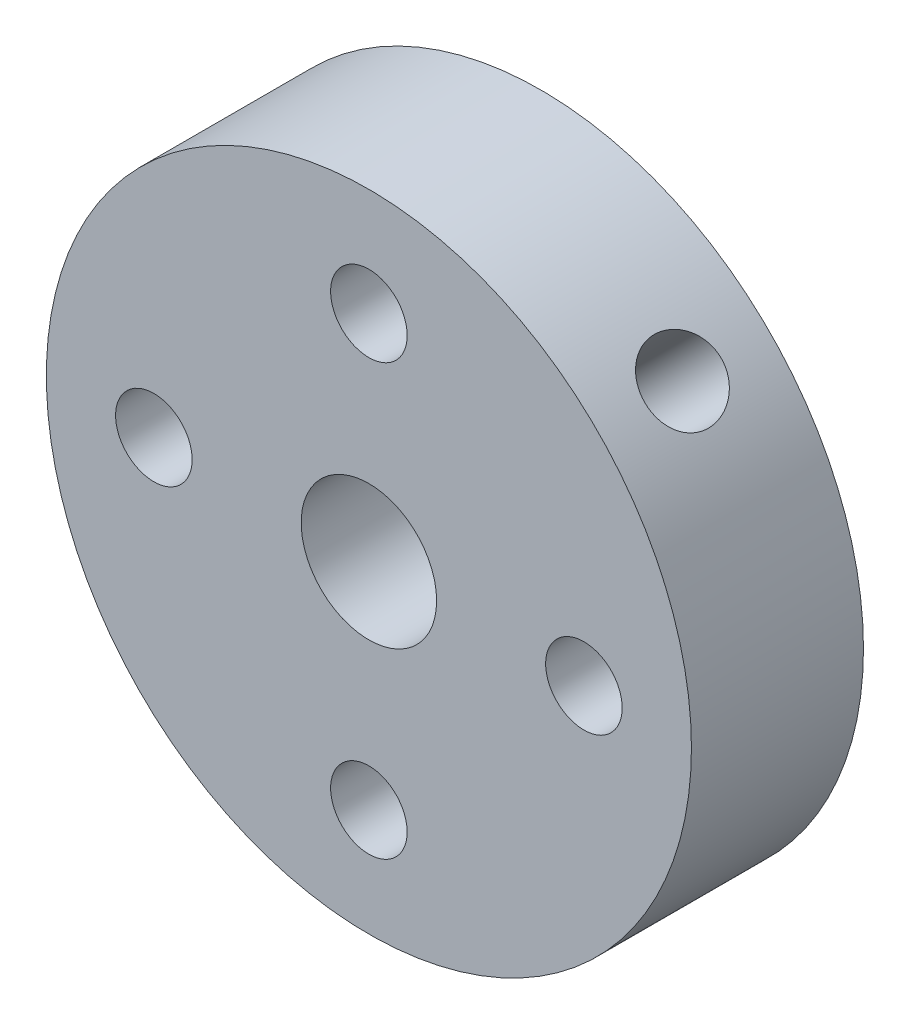
ISO-10303-21;
HEADER;
FILE_DESCRIPTION(('STEP AP214'),'2;1');
FILE_NAME('part.step','',(''),(''),'','','');
FILE_SCHEMA(('AUTOMOTIVE_DESIGN { 1 0 10303 214 1 1 1 1 }'));
ENDSEC;
DATA;
#1=APPLICATION_CONTEXT('core data for automotive mechanical design processes');
#2=APPLICATION_PROTOCOL_DEFINITION('international standard','automotive_design',2000,#1);
#3=PRODUCT_CONTEXT('',#1,'mechanical');
#4=PRODUCT('Part','Part','',(#3));
#5=PRODUCT_RELATED_PRODUCT_CATEGORY('part','',(#4));
#6=PRODUCT_DEFINITION_FORMATION('','',#4);
#7=PRODUCT_DEFINITION_CONTEXT('part definition',#1,'design');
#8=PRODUCT_DEFINITION('design','',#6,#7);
#9=PRODUCT_DEFINITION_SHAPE('','',#8);
#10=(LENGTH_UNIT() NAMED_UNIT(*) SI_UNIT(.MILLI.,.METRE.));
#11=(NAMED_UNIT(*) PLANE_ANGLE_UNIT() SI_UNIT($,.RADIAN.));
#12=(NAMED_UNIT(*) SI_UNIT($,.STERADIAN.) SOLID_ANGLE_UNIT());
#13=UNCERTAINTY_MEASURE_WITH_UNIT(LENGTH_MEASURE(1.E-05),#10,'distance_accuracy_value','');
#14=(GEOMETRIC_REPRESENTATION_CONTEXT(3) GLOBAL_UNCERTAINTY_ASSIGNED_CONTEXT((#13)) GLOBAL_UNIT_ASSIGNED_CONTEXT((#10,
#11,#12)) REPRESENTATION_CONTEXT('',''));
#15=CARTESIAN_POINT('',(0.,0.,0.));
#16=DIRECTION('',(0.,0.,1.));
#17=DIRECTION('',(1.,0.,0.));
#18=AXIS2_PLACEMENT_3D('',#15,#16,#17);
#19=CARTESIAN_POINT('',(0.,0.,5.08));
#20=DIRECTION('',(0.,0.,1.));
#21=DIRECTION('',(1.,0.,0.));
#22=AXIS2_PLACEMENT_3D('',#19,#20,#21);
#23=PLANE('',#22);
#24=CARTESIAN_POINT('',(6.35,0.,5.08));
#25=DIRECTION('',(0.,0.,1.));
#26=DIRECTION('',(1.,0.,0.));
#27=AXIS2_PLACEMENT_3D('',#24,#25,#26);
#28=CIRCLE('',#27,1.1303);
#29=CARTESIAN_POINT('',(7.4803,0.,5.08));
#30=VERTEX_POINT('',#29);
#31=EDGE_CURVE('E68',#30,#30,#28,.T.);
#32=ORIENTED_EDGE('',*,*,#31,.F.);
#33=EDGE_LOOP('',(#32));
#34=FACE_BOUND('',#33,.T.);
#35=CARTESIAN_POINT('',(-6.35,0.,5.08));
#36=DIRECTION('',(0.,0.,1.));
#37=DIRECTION('',(1.,0.,0.));
#38=AXIS2_PLACEMENT_3D('',#35,#36,#37);
#39=CIRCLE('',#38,1.1303);
#40=CARTESIAN_POINT('',(-5.2197,0.,5.08));
#41=VERTEX_POINT('',#40);
#42=EDGE_CURVE('E56',#41,#41,#39,.T.);
#43=ORIENTED_EDGE('',*,*,#42,.F.);
#44=EDGE_LOOP('',(#43));
#45=FACE_BOUND('',#44,.T.);
#46=CARTESIAN_POINT('',(0.,0.,5.08));
#47=DIRECTION('',(0.,0.,1.));
#48=DIRECTION('',(1.,0.,0.));
#49=AXIS2_PLACEMENT_3D('',#46,#47,#48);
#50=CIRCLE('',#49,9.525);
#51=CARTESIAN_POINT('',(9.525,0.,5.08));
#52=VERTEX_POINT('',#51);
#53=EDGE_CURVE('E10',#52,#52,#50,.T.);
#54=ORIENTED_EDGE('',*,*,#53,.T.);
#55=EDGE_LOOP('',(#54));
#56=FACE_BOUND('',#55,.T.);
#57=CARTESIAN_POINT('',(0.,0.,5.08));
#58=DIRECTION('',(0.,0.,1.));
#59=DIRECTION('',(1.,0.,0.));
#60=AXIS2_PLACEMENT_3D('',#57,#58,#59);
#61=CIRCLE('',#60,2.);
#62=CARTESIAN_POINT('',(2.,0.,5.08));
#63=VERTEX_POINT('',#62);
#64=EDGE_CURVE('E51',#63,#63,#61,.T.);
#65=ORIENTED_EDGE('',*,*,#64,.F.);
#66=EDGE_LOOP('',(#65));
#67=FACE_BOUND('',#66,.T.);
#68=CARTESIAN_POINT('',(0.,6.35,5.08));
#69=DIRECTION('',(0.,0.,1.));
#70=DIRECTION('',(1.,0.,0.));
#71=AXIS2_PLACEMENT_3D('',#68,#69,#70);
#72=CIRCLE('',#71,1.1303);
#73=CARTESIAN_POINT('',(1.13030000000002,6.35,5.08));
#74=VERTEX_POINT('',#73);
#75=EDGE_CURVE('E62',#74,#74,#72,.T.);
#76=ORIENTED_EDGE('',*,*,#75,.F.);
#77=EDGE_LOOP('',(#76));
#78=FACE_BOUND('',#77,.T.);
#79=CARTESIAN_POINT('',(0.,-6.35,5.08));
#80=DIRECTION('',(0.,0.,1.));
#81=DIRECTION('',(1.,0.,0.));
#82=AXIS2_PLACEMENT_3D('',#79,#80,#81);
#83=CIRCLE('',#82,1.1303);
#84=CARTESIAN_POINT('',(1.13029999999993,-6.35,5.08));
#85=VERTEX_POINT('',#84);
#86=EDGE_CURVE('E74',#85,#85,#83,.T.);
#87=ORIENTED_EDGE('',*,*,#86,.F.);
#88=EDGE_LOOP('',(#87));
#89=FACE_BOUND('',#88,.T.);
#90=ADVANCED_FACE('F33',(#34,#45,#56,#67,#78,#89),#23,.T.);
#91=CARTESIAN_POINT('',(0.,0.,0.));
#92=DIRECTION('',(0.,0.,1.));
#93=DIRECTION('',(1.,0.,0.));
#94=AXIS2_PLACEMENT_3D('',#91,#92,#93);
#95=PLANE('',#94);
#96=CARTESIAN_POINT('',(6.35,0.,0.));
#97=DIRECTION('',(0.,0.,1.));
#98=DIRECTION('',(1.,0.,0.));
#99=AXIS2_PLACEMENT_3D('',#96,#97,#98);
#100=CIRCLE('',#99,1.1303);
#101=CARTESIAN_POINT('',(7.4803,0.,0.));
#102=VERTEX_POINT('',#101);
#103=EDGE_CURVE('E71',#102,#102,#100,.T.);
#104=ORIENTED_EDGE('',*,*,#103,.T.);
#105=EDGE_LOOP('',(#104));
#106=FACE_BOUND('',#105,.T.);
#107=CARTESIAN_POINT('',(-6.35,0.,0.));
#108=DIRECTION('',(0.,0.,1.));
#109=DIRECTION('',(1.,0.,0.));
#110=AXIS2_PLACEMENT_3D('',#107,#108,#109);
#111=CIRCLE('',#110,1.1303);
#112=CARTESIAN_POINT('',(-5.2197,0.,0.));
#113=VERTEX_POINT('',#112);
#114=EDGE_CURVE('E59',#113,#113,#111,.T.);
#115=ORIENTED_EDGE('',*,*,#114,.T.);
#116=EDGE_LOOP('',(#115));
#117=FACE_BOUND('',#116,.T.);
#118=CARTESIAN_POINT('',(0.,0.,0.));
#119=DIRECTION('',(0.,0.,1.));
#120=DIRECTION('',(1.,0.,0.));
#121=AXIS2_PLACEMENT_3D('',#118,#119,#120);
#122=CIRCLE('',#121,9.525);
#123=CARTESIAN_POINT('',(9.525,0.,0.));
#124=VERTEX_POINT('',#123);
#125=EDGE_CURVE('E46',#124,#124,#122,.T.);
#126=ORIENTED_EDGE('',*,*,#125,.F.);
#127=EDGE_LOOP('',(#126));
#128=FACE_BOUND('',#127,.T.);
#129=CARTESIAN_POINT('',(0.,0.,0.));
#130=DIRECTION('',(0.,0.,1.));
#131=DIRECTION('',(1.,0.,0.));
#132=AXIS2_PLACEMENT_3D('',#129,#130,#131);
#133=CIRCLE('',#132,2.);
#134=CARTESIAN_POINT('',(2.,0.,0.));
#135=VERTEX_POINT('',#134);
#136=EDGE_CURVE('E53',#135,#135,#133,.T.);
#137=ORIENTED_EDGE('',*,*,#136,.T.);
#138=EDGE_LOOP('',(#137));
#139=FACE_BOUND('',#138,.T.);
#140=CARTESIAN_POINT('',(0.,6.35,0.));
#141=DIRECTION('',(0.,0.,1.));
#142=DIRECTION('',(1.,0.,0.));
#143=AXIS2_PLACEMENT_3D('',#140,#141,#142);
#144=CIRCLE('',#143,1.1303);
#145=CARTESIAN_POINT('',(1.13030000000002,6.35,0.));
#146=VERTEX_POINT('',#145);
#147=EDGE_CURVE('E65',#146,#146,#144,.T.);
#148=ORIENTED_EDGE('',*,*,#147,.T.);
#149=EDGE_LOOP('',(#148));
#150=FACE_BOUND('',#149,.T.);
#151=CARTESIAN_POINT('',(0.,-6.35,0.));
#152=DIRECTION('',(0.,0.,1.));
#153=DIRECTION('',(1.,0.,0.));
#154=AXIS2_PLACEMENT_3D('',#151,#152,#153);
#155=CIRCLE('',#154,1.1303);
#156=CARTESIAN_POINT('',(1.13029999999993,-6.35,0.));
#157=VERTEX_POINT('',#156);
#158=EDGE_CURVE('E77',#157,#157,#155,.T.);
#159=ORIENTED_EDGE('',*,*,#158,.T.);
#160=EDGE_LOOP('',(#159));
#161=FACE_BOUND('',#160,.T.);
#162=ADVANCED_FACE('F113',(#106,#117,#128,#139,#150,#161),#95,.F.);
#163=CARTESIAN_POINT('',(0.,0.,5.08));
#164=DIRECTION('',(0.,0.,-1.));
#165=DIRECTION('',(-1.,0.,0.));
#166=AXIS2_PLACEMENT_3D('',#163,#164,#165);
#167=CYLINDRICAL_SURFACE('',#166,9.525);
#168=CARTESIAN_POINT('',(5.88835942537819,7.48684501492851,2.54));
#169=CARTESIAN_POINT('',(5.88836195095317,7.48684371644301,2.47675083023152));
#170=CARTESIAN_POINT('',(5.89257955251751,7.48353185659465,2.41346150046686));
#171=CARTESIAN_POINT('',(5.90930099826138,7.47033438245385,2.28864237142658));
#172=CARTESIAN_POINT('',(5.92181363090027,7.46044179594316,2.22711451060301));
#173=CARTESIAN_POINT('',(5.95464092558272,7.43426622977027,2.10764367538076));
#174=CARTESIAN_POINT('',(5.97495044743216,7.4179874601227,2.04969836829954));
#175=CARTESIAN_POINT('',(6.02261482930935,7.37934092821963,1.93898333748816));
#176=CARTESIAN_POINT('',(6.04996843169233,7.35697425285361,1.88621269219769));
#177=CARTESIAN_POINT('',(6.11088325226502,7.30645598401452,1.78706674838293));
#178=CARTESIAN_POINT('',(6.14447193256567,7.27827873476532,1.74072139175397));
#179=CARTESIAN_POINT('',(6.21661016004974,7.2167600545004,1.65600003105462));
#180=CARTESIAN_POINT('',(6.25515994832758,7.18341837249326,1.61762441452585));
#181=CARTESIAN_POINT('',(6.33604808507048,7.11217466377855,1.54982538353728));
#182=CARTESIAN_POINT('',(6.3783973580081,7.07425937164084,1.52042892784532));
#183=CARTESIAN_POINT('',(6.46540207301569,6.99483143682025,1.47159528680366));
#184=CARTESIAN_POINT('',(6.5100574375236,6.95331891509317,1.45215776673944));
#185=CARTESIAN_POINT('',(6.60005194815221,6.86795208289868,1.42388283449897));
#186=CARTESIAN_POINT('',(6.64538686637488,6.82410976435156,1.41499577009914));
#187=CARTESIAN_POINT('',(6.73558439792912,6.73509773549741,1.40792020794054));
#188=CARTESIAN_POINT('',(6.7804470280509,6.68992807259647,1.40973132855718));
#189=CARTESIAN_POINT('',(6.86820386152361,6.599798372251,1.42396079393402));
#190=CARTESIAN_POINT('',(6.91110683052498,6.55483842314752,1.4363257418347));
#191=CARTESIAN_POINT('',(6.9940586173456,6.46625499744921,1.47122847396179));
#192=CARTESIAN_POINT('',(7.0341073854703,6.42263154413169,1.49376643526071));
#193=CARTESIAN_POINT('',(7.11047389982341,6.33798444025193,1.54843268947244));
#194=CARTESIAN_POINT('',(7.14678231052368,6.29696738819746,1.5805842326774));
#195=CARTESIAN_POINT('',(7.21474731577014,6.21898110942085,1.65354808279929));
#196=CARTESIAN_POINT('',(7.24640371790586,6.18201205014275,1.69436074777599));
#197=CARTESIAN_POINT('',(7.30459052177825,6.1131523151431,1.78378773040749));
#198=CARTESIAN_POINT('',(7.33108814330646,6.08129432791138,1.83244856131957));
#199=CARTESIAN_POINT('',(7.37819326489261,6.02405740006055,1.93603038653666));
#200=CARTESIAN_POINT('',(7.39880074961866,5.99867847630631,1.99095139713625));
#201=CARTESIAN_POINT('',(7.43374431095623,5.95532114846176,2.1055342677617));
#202=CARTESIAN_POINT('',(7.44807813319183,5.93734540476463,2.16519782288701));
#203=CARTESIAN_POINT('',(7.47019783719619,5.90949139153398,2.28755178056522));
#204=CARTESIAN_POINT('',(7.47798400239078,5.89961277150397,2.35024205197765));
#205=CARTESIAN_POINT('',(7.48683917624636,5.88837124710133,2.47646170976712));
#206=CARTESIAN_POINT('',(7.48794874725196,5.88695691985536,2.53998367450721));
#207=CARTESIAN_POINT('',(7.48353900948199,5.89256150655298,2.66642145646119));
#208=CARTESIAN_POINT('',(7.47801982772236,5.89958025890725,2.72933728526618));
#209=CARTESIAN_POINT('',(7.4604797638959,5.92174496154769,2.85258339037514));
#210=CARTESIAN_POINT('',(7.44847854956712,5.93686632585195,2.91292089524452));
#211=CARTESIAN_POINT('',(7.41820432802201,5.9746507992698,3.02952333352779));
#212=CARTESIAN_POINT('',(7.39993112116802,5.99731414844423,3.08578813723847));
#213=CARTESIAN_POINT('',(7.3573459879704,6.04948095685633,3.1929429018076));
#214=CARTESIAN_POINT('',(7.33300567509898,6.0790165250561,3.24380594689318));
#215=CARTESIAN_POINT('',(7.27879532574687,6.14382158701823,3.33843921221188));
#216=CARTESIAN_POINT('',(7.24892509577832,6.17909128140833,3.38220918416288));
#217=CARTESIAN_POINT('',(7.18409133135529,6.25435300526256,3.46164117510913));
#218=CARTESIAN_POINT('',(7.14910250445824,6.29436828646216,3.49726053799617));
#219=CARTESIAN_POINT('',(7.07491631826807,6.3776397837772,3.55908550257747));
#220=CARTESIAN_POINT('',(7.03571903657591,6.42089594012874,3.58529127781298));
#221=CARTESIAN_POINT('',(6.95415461445161,6.50914409325839,3.62747423592636));
#222=CARTESIAN_POINT('',(6.91179549296077,6.55413156743956,3.64347637414357));
#223=CARTESIAN_POINT('',(6.82492284724016,6.64454523148135,3.66487907550036));
#224=CARTESIAN_POINT('',(6.78040941016546,6.68997140353457,3.67028006715352));
#225=CARTESIAN_POINT('',(6.69074810034106,6.77963941018955,3.67031970142616));
#226=CARTESIAN_POINT('',(6.64560580297417,6.82388680503418,3.66502423763516));
#227=CARTESIAN_POINT('',(6.55574227788335,6.91026438272434,3.64396046052651));
#228=CARTESIAN_POINT('',(6.51102105005992,6.95239456607021,3.62819214968382));
#229=CARTESIAN_POINT('',(6.42338189252386,7.03344543435096,3.58665033089502));
#230=CARTESIAN_POINT('',(6.38046345683568,7.07236702280911,3.5608796513112));
#231=CARTESIAN_POINT('',(6.29777674855962,7.1460972155007,3.50007146474908));
#232=CARTESIAN_POINT('',(6.25800849834253,7.18090579052678,3.46503389197037));
#233=CARTESIAN_POINT('',(6.18270115855429,7.24584863898786,3.38644164568462));
#234=CARTESIAN_POINT('',(6.14718843076923,7.27595409486117,3.34283789712583));
#235=CARTESIAN_POINT('',(6.08187599996231,7.33063630645185,3.24845211130754));
#236=CARTESIAN_POINT('',(6.05207765639619,7.35521174681543,3.19766837090296));
#237=CARTESIAN_POINT('',(5.99917191408572,7.3984279339773,3.09016285265355));
#238=CARTESIAN_POINT('',(5.97608822328395,7.41704767502981,3.03342097479024));
#239=CARTESIAN_POINT('',(5.93763032888588,7.44787110310117,2.91578612799387));
#240=CARTESIAN_POINT('',(5.92224765516634,7.46008183991524,2.85489780375564));
#241=CARTESIAN_POINT('',(5.90349319273591,7.47492339005222,2.75140489514775));
#242=CARTESIAN_POINT('',(5.89782818173787,7.47938976260326,2.70945572036591));
#243=CARTESIAN_POINT('',(5.8902604616154,7.48535100167703,2.62501040961091));
#244=CARTESIAN_POINT('',(5.88835772775915,7.4868458877332,2.58251427723511));
#245=CARTESIAN_POINT('',(5.88835942537819,7.48684501492851,2.54));
#246=B_SPLINE_CURVE_WITH_KNOTS('',3,(#168,#169,#170,#171,#172,#173,#174,#175,#176,#177,#178,
#179,#180,#181,#182,#183,#184,#185,#186,#187,#188,#189,#190,#191,#192,#193,#194,#195,#196,#197,
#198,#199,#200,#201,#202,#203,#204,#205,#206,#207,#208,#209,#210,#211,#212,#213,#214,#215,#216,
#217,#218,#219,#220,#221,#222,#223,#224,#225,#226,#227,#228,#229,#230,#231,#232,#233,#234,#235,
#236,#237,#238,#239,#240,#241,#242,#243,#244,#245),.UNSPECIFIED.,.T.,.F.,(4,2,2,2,2,2,2,2,2,2,2,
2,2,2,2,2,2,2,2,2,2,2,2,2,2,2,2,2,2,2,2,2,2,2,2,2,2,2,4),(0.,0.18959221388925,0.379385619561867,
0.569054115897611,0.758688772414149,0.949179385544421,1.13967925942422,1.33074558653033,
1.52180549157747,1.71196262630948,1.90211297781599,2.09130693212656,2.28050417969351,
2.4701627505348,2.65982916358627,2.85066401887306,3.04149937089376,3.23240324144272,
3.42329884798683,3.61303352504166,3.80276456657904,3.99192313524191,4.18108772538462,
4.37115455334501,4.56122803286597,4.7522745994211,4.94331764381635,5.13389163804311,
5.32445792883671,5.51385385073963,5.70324972788426,5.89259208867053,6.08193579393566,
6.27239765084127,6.46290476268864,6.65407656758035,6.84503764369971,6.97247692802296,
7.09991537460509),.UNSPECIFIED.);
#247=CARTESIAN_POINT('',(5.88835942537819,7.48684501492851,2.54));
#248=VERTEX_POINT('',#247);
#249=EDGE_CURVE('E80',#248,#248,#246,.T.);
#250=ORIENTED_EDGE('',*,*,#249,.T.);
#251=EDGE_LOOP('',(#250));
#252=FACE_BOUND('',#251,.T.);
#253=ORIENTED_EDGE('',*,*,#53,.F.);
#254=EDGE_LOOP('',(#253));
#255=FACE_BOUND('',#254,.T.);
#256=ORIENTED_EDGE('',*,*,#125,.T.);
#257=EDGE_LOOP('',(#256));
#258=FACE_BOUND('',#257,.T.);
#259=ADVANCED_FACE('F35',(#252,#255,#258),#167,.T.);
#260=CARTESIAN_POINT('',(0.,0.,5.08));
#261=DIRECTION('',(0.,0.,-1.));
#262=DIRECTION('',(-1.,0.,0.));
#263=AXIS2_PLACEMENT_3D('',#260,#261,#262);
#264=CYLINDRICAL_SURFACE('',#263,2.);
#265=CARTESIAN_POINT('',(0.367466661344919,1.96595225089523,2.54));
#266=CARTESIAN_POINT('',(0.367469796813495,1.96595288226126,2.48235721050688));
#267=CARTESIAN_POINT('',(0.372772464971211,1.96498290328754,2.42470129890544));
#268=CARTESIAN_POINT('',(0.393425057028185,1.96094900430477,2.31127590572929));
#269=CARTESIAN_POINT('',(0.40878600490776,1.95788278663336,2.25550856466133));
#270=CARTESIAN_POINT('',(0.448030525054973,1.94927289384264,2.14771379484587));
#271=CARTESIAN_POINT('',(0.471859939422233,1.94374490674539,2.09566506835939));
#272=CARTESIAN_POINT('',(0.526450120750283,1.92967438790692,1.99580784162425));
#273=CARTESIAN_POINT('',(0.557213079437348,1.92113090246794,1.94800068883125));
#274=CARTESIAN_POINT('',(0.62776415232903,1.89931967200514,1.85235593740766));
#275=CARTESIAN_POINT('',(0.66816615129895,1.88564377253232,1.805064093406));
#276=CARTESIAN_POINT('',(0.753843747822659,1.85305758658984,1.71712247036296));
#277=CARTESIAN_POINT('',(0.799122391809093,1.83414401642923,1.67647688361652));
#278=CARTESIAN_POINT('',(0.897200713041526,1.78835648342144,1.59928818834819));
#279=CARTESIAN_POINT('',(0.950308960755301,1.7609095577645,1.56346832075461));
#280=CARTESIAN_POINT('',(1.05799721275853,1.69838319254608,1.50217536674408));
#281=CARTESIAN_POINT('',(1.11257599026981,1.66330995239748,1.47669392418393));
#282=CARTESIAN_POINT('',(1.21595846618257,1.58906772426166,1.43914233517405));
#283=CARTESIAN_POINT('',(1.26485195909276,1.55051924757064,1.42609940980754));
#284=CARTESIAN_POINT('',(1.35968398481181,1.46805841375092,1.41053750414546));
#285=CARTESIAN_POINT('',(1.40562487338845,1.42415041595702,1.40801002872237));
#286=CARTESIAN_POINT('',(1.48795538556206,1.3375953353256,1.41330243256011));
#287=CARTESIAN_POINT('',(1.5248395380158,1.2953441467364,1.42001083697577));
#288=CARTESIAN_POINT('',(1.59402206500385,1.20919219785778,1.44151793298605));
#289=CARTESIAN_POINT('',(1.62632010255697,1.16529131665072,1.45631721869997));
#290=CARTESIAN_POINT('',(1.68619532991075,1.07685984467915,1.49354831362181));
#291=CARTESIAN_POINT('',(1.71372491028095,1.03232722788112,1.51605108455523));
#292=CARTESIAN_POINT('',(1.76370074507378,0.94441524750481,1.56788094100558));
#293=CARTESIAN_POINT('',(1.78614545976777,0.90103623674573,1.5972100881554));
#294=CARTESIAN_POINT('',(1.82849143768828,0.811980699796413,1.66557489987538));
#295=CARTESIAN_POINT('',(1.84782970625323,0.766587652642932,1.70532836539113));
#296=CARTESIAN_POINT('',(1.88127495123675,0.680401798859257,1.79154578239276));
#297=CARTESIAN_POINT('',(1.89537569798358,0.639614510320813,1.83801763428868));
#298=CARTESIAN_POINT('',(1.92024776574855,0.560815248989715,1.94170265097221));
#299=CARTESIAN_POINT('',(1.93056841902368,0.523447518475695,1.9995190240627));
#300=CARTESIAN_POINT('',(1.94687234124287,0.459127219923682,2.12121679026231));
#301=CARTESIAN_POINT('',(1.95286320553351,0.432156452444812,2.18508733928911));
#302=CARTESIAN_POINT('',(1.96048049921216,0.395951506025223,2.30228591254559));
#303=CARTESIAN_POINT('',(1.9627848973695,0.384094479903822,2.35476062144389));
#304=CARTESIAN_POINT('',(1.96563023630636,0.369267670965051,2.46098259161437));
#305=CARTESIAN_POINT('',(1.96617279629187,0.366289728089751,2.51472863867662));
#306=CARTESIAN_POINT('',(1.96557333486648,0.369490374418399,2.62195410703307));
#307=CARTESIAN_POINT('',(1.96443056135405,0.375673051671504,2.67543339859608));
#308=CARTESIAN_POINT('',(1.96030411864185,0.39663367914801,2.7806136442152));
#309=CARTESIAN_POINT('',(1.95731913552099,0.411417763730605,2.83231330116978));
#310=CARTESIAN_POINT('',(1.94910810702702,0.448713721369055,2.9335103984712));
#311=CARTESIAN_POINT('',(1.94384898934396,0.47133861817049,2.98296294965967));
#312=CARTESIAN_POINT('',(1.93062082214848,0.522886548130614,3.07806088023951));
#313=CARTESIAN_POINT('',(1.92265064924703,0.55181219036055,3.1237046716026));
#314=CARTESIAN_POINT('',(1.9019225593483,0.619796809383486,3.21775291115333));
#315=CARTESIAN_POINT('',(1.88859614540959,0.659738947345635,3.26539544327375));
#316=CARTESIAN_POINT('',(1.85677727007002,0.744603598545832,3.35411733628725));
#317=CARTESIAN_POINT('',(1.83828069023369,0.789530064908111,3.39519142373205));
#318=CARTESIAN_POINT('',(1.79339208742894,0.887066256091514,3.47343442051247));
#319=CARTESIAN_POINT('',(1.76642184847191,0.940001326059562,3.50987467941604));
#320=CARTESIAN_POINT('',(1.7048667216549,1.04749853073205,3.57249838849152));
#321=CARTESIAN_POINT('',(1.67028801011076,1.10205931485096,3.59869011045946));
#322=CARTESIAN_POINT('',(1.5967906897217,1.20580263095864,3.63776441042464));
#323=CARTESIAN_POINT('',(1.55846688759984,1.25505700347852,3.65156798921066));
#324=CARTESIAN_POINT('',(1.47632439561899,1.35071387808568,3.66858448818166));
#325=CARTESIAN_POINT('',(1.43251033058913,1.39711873206449,3.67180626071963));
#326=CARTESIAN_POINT('',(1.34609835622707,1.48027289271462,3.66772533315737));
#327=CARTESIAN_POINT('',(1.30391972717075,1.51752099235784,3.66156764604882));
#328=CARTESIAN_POINT('',(1.21781029488282,1.58745528710618,3.64109388051504));
#329=CARTESIAN_POINT('',(1.17387938788475,1.62014121153097,3.62677731826812));
#330=CARTESIAN_POINT('',(1.08549260093224,1.68065237875243,3.59051840067738));
#331=CARTESIAN_POINT('',(1.04103519324213,1.7084524312556,3.56853817370264));
#332=CARTESIAN_POINT('',(0.953181807344802,1.75898157056552,3.51773403997969));
#333=CARTESIAN_POINT('',(0.909786137301627,1.78170920031491,3.48890817171113));
#334=CARTESIAN_POINT('',(0.820676063574802,1.82460842457799,3.42164679657105));
#335=CARTESIAN_POINT('',(0.775229224679488,1.84422642730733,3.38250414123616));
#336=CARTESIAN_POINT('',(0.688789309248772,1.87822568820466,3.2975118741746));
#337=CARTESIAN_POINT('',(0.647801639873065,1.89260063727007,3.25165427452177));
#338=CARTESIAN_POINT('',(0.568269435503897,1.91806681149674,3.14909677807817));
#339=CARTESIAN_POINT('',(0.530373552791632,1.92868912257257,3.09177211133407));
#340=CARTESIAN_POINT('',(0.464795450505886,1.94553836491796,2.97099110802815));
#341=CARTESIAN_POINT('',(0.437094620404753,1.95177332423795,2.90754621362511));
#342=CARTESIAN_POINT('',(0.400147751650427,1.95962755540473,2.79325736152766));
#343=CARTESIAN_POINT('',(0.387979816878751,1.96202414581381,2.74340721220073));
#344=CARTESIAN_POINT('',(0.371640896015276,1.96518559766214,2.64237413504364));
#345=CARTESIAN_POINT('',(0.367463876752631,1.96595169018256,2.59119224230252));
#346=CARTESIAN_POINT('',(0.367466661344919,1.96595225089523,2.54));
#347=B_SPLINE_CURVE_WITH_KNOTS('',3,(#265,#266,#267,#268,#269,#270,#271,#272,#273,#274,#275,
#276,#277,#278,#279,#280,#281,#282,#283,#284,#285,#286,#287,#288,#289,#290,#291,#292,#293,#294,
#295,#296,#297,#298,#299,#300,#301,#302,#303,#304,#305,#306,#307,#308,#309,#310,#311,#312,#313,
#314,#315,#316,#317,#318,#319,#320,#321,#322,#323,#324,#325,#326,#327,#328,#329,#330,#331,#332,
#333,#334,#335,#336,#337,#338,#339,#340,#341,#342,#343,#344,#345,#346),.UNSPECIFIED.,.T.,.F.,(4,
2,2,2,2,2,2,2,2,2,2,2,2,2,2,2,2,2,2,2,2,2,2,2,2,2,2,2,2,2,2,2,2,2,2,2,2,2,2,2,4),(0.,
0.172714547215531,0.345618708955109,0.517436437246626,0.689308554301198,0.87959907579275,
1.07000916864728,1.27796638228384,1.48575517580491,1.67549260046226,1.86507671194829,
2.03373205128987,2.2023997767796,2.37266499075217,2.5429816933737,2.73229686398524,
2.92183649631279,3.1296061544957,3.33701045113427,3.49784081446661,3.65852332579862,
3.81927756544952,3.98014659273003,4.14343822659733,4.30679760676135,4.49677368850957,
4.68690153423371,4.89487903568528,5.10268832642678,5.29332411666533,5.48380038728327,
5.65281337261856,5.82183638147514,5.99170677739715,6.1616259060982,6.350178142012,
6.53895652496093,6.74651430024832,6.95369128819529,7.10719406259539,7.26058089602202),.UNSPECIFIED.);
#348=CARTESIAN_POINT('',(0.367466661344919,1.96595225089523,2.54));
#349=VERTEX_POINT('',#348);
#350=EDGE_CURVE('E38',#349,#349,#347,.T.);
#351=ORIENTED_EDGE('',*,*,#350,.F.);
#352=EDGE_LOOP('',(#351));
#353=FACE_BOUND('',#352,.T.);
#354=ORIENTED_EDGE('',*,*,#64,.T.);
#355=EDGE_LOOP('',(#354));
#356=FACE_BOUND('',#355,.T.);
#357=ORIENTED_EDGE('',*,*,#136,.F.);
#358=EDGE_LOOP('',(#357));
#359=FACE_BOUND('',#358,.T.);
#360=ADVANCED_FACE('F106',(#353,#356,#359),#264,.F.);
#361=CARTESIAN_POINT('',(-6.35,0.,5.08));
#362=DIRECTION('',(0.,0.,-1.));
#363=DIRECTION('',(-1.,0.,0.));
#364=AXIS2_PLACEMENT_3D('',#361,#362,#363);
#365=CYLINDRICAL_SURFACE('',#364,1.1303);
#366=ORIENTED_EDGE('',*,*,#42,.T.);
#367=EDGE_LOOP('',(#366));
#368=FACE_BOUND('',#367,.T.);
#369=ORIENTED_EDGE('',*,*,#114,.F.);
#370=EDGE_LOOP('',(#369));
#371=FACE_BOUND('',#370,.T.);
#372=ADVANCED_FACE('F103',(#368,#371),#365,.F.);
#373=CARTESIAN_POINT('',(0.,6.35,5.08));
#374=DIRECTION('',(0.,0.,-1.));
#375=DIRECTION('',(-1.,0.,0.));
#376=AXIS2_PLACEMENT_3D('',#373,#374,#375);
#377=CYLINDRICAL_SURFACE('',#376,1.1303);
#378=ORIENTED_EDGE('',*,*,#75,.T.);
#379=EDGE_LOOP('',(#378));
#380=FACE_BOUND('',#379,.T.);
#381=ORIENTED_EDGE('',*,*,#147,.F.);
#382=EDGE_LOOP('',(#381));
#383=FACE_BOUND('',#382,.T.);
#384=ADVANCED_FACE('F99',(#380,#383),#377,.F.);
#385=CARTESIAN_POINT('',(6.35,0.,5.08));
#386=DIRECTION('',(0.,0.,-1.));
#387=DIRECTION('',(-1.,0.,0.));
#388=AXIS2_PLACEMENT_3D('',#385,#386,#387);
#389=CYLINDRICAL_SURFACE('',#388,1.1303);
#390=ORIENTED_EDGE('',*,*,#31,.T.);
#391=EDGE_LOOP('',(#390));
#392=FACE_BOUND('',#391,.T.);
#393=ORIENTED_EDGE('',*,*,#103,.F.);
#394=EDGE_LOOP('',(#393));
#395=FACE_BOUND('',#394,.T.);
#396=ADVANCED_FACE('F95',(#392,#395),#389,.F.);
#397=CARTESIAN_POINT('',(0.,-6.35,5.08));
#398=DIRECTION('',(0.,0.,-1.));
#399=DIRECTION('',(-1.,0.,0.));
#400=AXIS2_PLACEMENT_3D('',#397,#398,#399);
#401=CYLINDRICAL_SURFACE('',#400,1.1303);
#402=ORIENTED_EDGE('',*,*,#86,.T.);
#403=EDGE_LOOP('',(#402));
#404=FACE_BOUND('',#403,.T.);
#405=ORIENTED_EDGE('',*,*,#158,.F.);
#406=EDGE_LOOP('',(#405));
#407=FACE_BOUND('',#406,.T.);
#408=ADVANCED_FACE('F90',(#404,#407),#401,.F.);
#409=CARTESIAN_POINT('',(-0.449012806053457,-0.449012806053455,2.54));
#410=DIRECTION('',(0.707106781186548,0.707106781186548,0.));
#411=DIRECTION('',(-0.707106781186548,0.707106781186548,0.));
#412=AXIS2_PLACEMENT_3D('',#409,#410,#411);
#413=CYLINDRICAL_SURFACE('',#412,1.1303);
#414=ORIENTED_EDGE('',*,*,#350,.T.);
#415=EDGE_LOOP('',(#414));
#416=FACE_BOUND('',#415,.T.);
#417=ORIENTED_EDGE('',*,*,#249,.F.);
#418=EDGE_LOOP('',(#417));
#419=FACE_BOUND('',#418,.T.);
#420=ADVANCED_FACE('F86',(#416,#419),#413,.F.);
#421=CLOSED_SHELL('',(#90,#162,#259,#360,#372,#384,#396,#408,#420));
#422=MANIFOLD_SOLID_BREP('B2',#421);
#423=ADVANCED_BREP_SHAPE_REPRESENTATION('',(#18,#422),#14);
#424=SHAPE_DEFINITION_REPRESENTATION(#9,#423);
ENDSEC;
END-ISO-10303-21;
